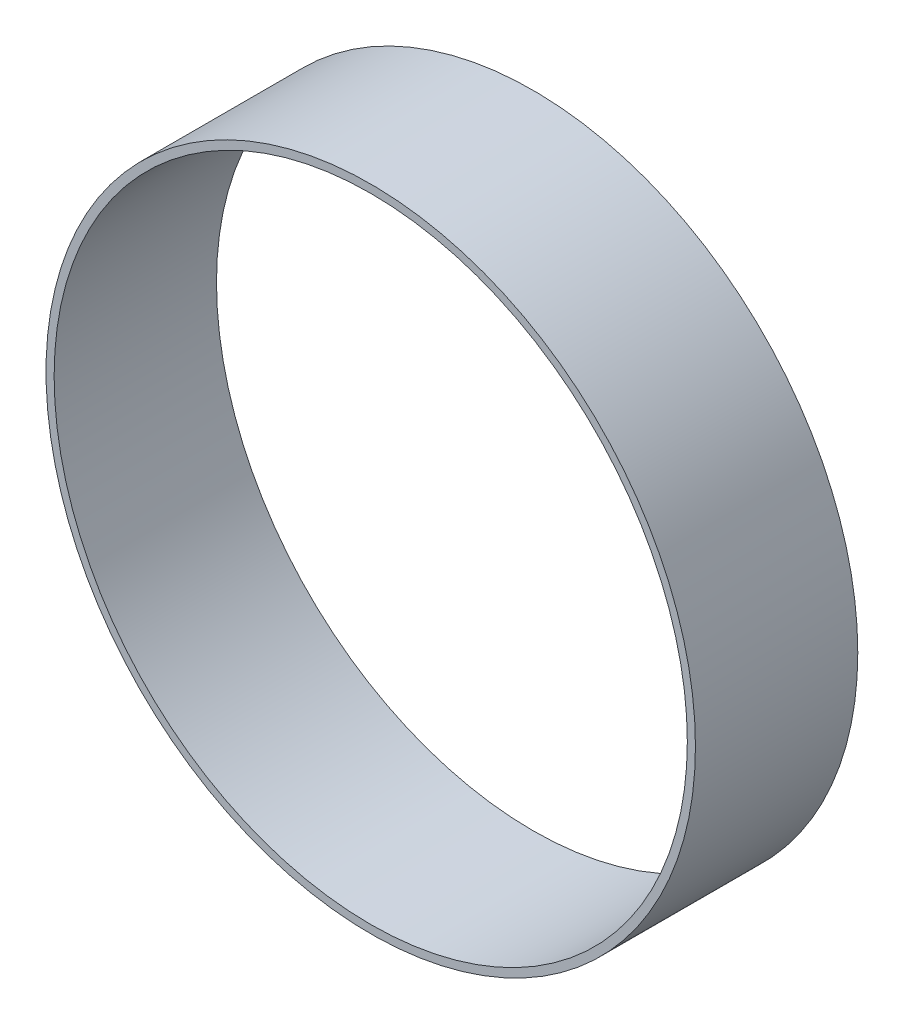
ISO-10303-21;
HEADER;
FILE_DESCRIPTION(('STEP AP214'),'2;1');
FILE_NAME('part.step','',(''),(''),'','','');
FILE_SCHEMA(('AUTOMOTIVE_DESIGN { 1 0 10303 214 1 1 1 1 }'));
ENDSEC;
DATA;
#1=APPLICATION_CONTEXT('core data for automotive mechanical design processes');
#2=APPLICATION_PROTOCOL_DEFINITION('international standard','automotive_design',2000,#1);
#3=PRODUCT_CONTEXT('',#1,'mechanical');
#4=PRODUCT('Part','Part','',(#3));
#5=PRODUCT_RELATED_PRODUCT_CATEGORY('part','',(#4));
#6=PRODUCT_DEFINITION_FORMATION('','',#4);
#7=PRODUCT_DEFINITION_CONTEXT('part definition',#1,'design');
#8=PRODUCT_DEFINITION('design','',#6,#7);
#9=PRODUCT_DEFINITION_SHAPE('','',#8);
#10=(LENGTH_UNIT() NAMED_UNIT(*) SI_UNIT(.MILLI.,.METRE.));
#11=(NAMED_UNIT(*) PLANE_ANGLE_UNIT() SI_UNIT($,.RADIAN.));
#12=(NAMED_UNIT(*) SI_UNIT($,.STERADIAN.) SOLID_ANGLE_UNIT());
#13=UNCERTAINTY_MEASURE_WITH_UNIT(LENGTH_MEASURE(1.E-05),#10,'distance_accuracy_value','');
#14=(GEOMETRIC_REPRESENTATION_CONTEXT(3) GLOBAL_UNCERTAINTY_ASSIGNED_CONTEXT((#13)) GLOBAL_UNIT_ASSIGNED_CONTEXT((#10,
#11,#12)) REPRESENTATION_CONTEXT('',''));
#15=CARTESIAN_POINT('',(0.,0.,0.));
#16=DIRECTION('',(0.,0.,1.));
#17=DIRECTION('',(1.,0.,0.));
#18=AXIS2_PLACEMENT_3D('',#15,#16,#17);
#19=CARTESIAN_POINT('',(0.,0.,25.4));
#20=DIRECTION('',(0.,0.,1.));
#21=DIRECTION('',(1.,0.,0.));
#22=AXIS2_PLACEMENT_3D('',#19,#20,#21);
#23=PLANE('',#22);
#24=CARTESIAN_POINT('',(0.,0.,25.4));
#25=DIRECTION('',(0.,0.,1.));
#26=DIRECTION('',(1.,0.,0.));
#27=AXIS2_PLACEMENT_3D('',#24,#25,#26);
#28=CIRCLE('',#27,50.8);
#29=CARTESIAN_POINT('',(50.8,0.,25.4));
#30=VERTEX_POINT('',#29);
#31=EDGE_CURVE('E10',#30,#30,#28,.T.);
#32=ORIENTED_EDGE('',*,*,#31,.T.);
#33=EDGE_LOOP('',(#32));
#34=FACE_BOUND('',#33,.T.);
#35=CARTESIAN_POINT('',(0.,0.,25.4));
#36=DIRECTION('',(0.,0.,1.));
#37=DIRECTION('',(1.,0.,0.));
#38=AXIS2_PLACEMENT_3D('',#35,#36,#37);
#39=CIRCLE('',#38,49.53);
#40=CARTESIAN_POINT('',(49.53,0.,25.4));
#41=VERTEX_POINT('',#40);
#42=EDGE_CURVE('E42',#41,#41,#39,.T.);
#43=ORIENTED_EDGE('',*,*,#42,.F.);
#44=EDGE_LOOP('',(#43));
#45=FACE_BOUND('',#44,.T.);
#46=ADVANCED_FACE('F31',(#34,#45),#23,.T.);
#47=CARTESIAN_POINT('',(0.,0.,0.));
#48=DIRECTION('',(0.,0.,1.));
#49=DIRECTION('',(1.,0.,0.));
#50=AXIS2_PLACEMENT_3D('',#47,#48,#49);
#51=PLANE('',#50);
#52=CARTESIAN_POINT('',(0.,0.,0.));
#53=DIRECTION('',(0.,0.,1.));
#54=DIRECTION('',(1.,0.,0.));
#55=AXIS2_PLACEMENT_3D('',#52,#53,#54);
#56=CIRCLE('',#55,50.8);
#57=CARTESIAN_POINT('',(50.8,0.,0.));
#58=VERTEX_POINT('',#57);
#59=EDGE_CURVE('E35',#58,#58,#56,.T.);
#60=ORIENTED_EDGE('',*,*,#59,.F.);
#61=EDGE_LOOP('',(#60));
#62=FACE_BOUND('',#61,.T.);
#63=CARTESIAN_POINT('',(0.,0.,0.));
#64=DIRECTION('',(0.,0.,1.));
#65=DIRECTION('',(1.,0.,0.));
#66=AXIS2_PLACEMENT_3D('',#63,#64,#65);
#67=CIRCLE('',#66,49.53);
#68=CARTESIAN_POINT('',(49.53,0.,0.));
#69=VERTEX_POINT('',#68);
#70=EDGE_CURVE('E44',#69,#69,#67,.T.);
#71=ORIENTED_EDGE('',*,*,#70,.T.);
#72=EDGE_LOOP('',(#71));
#73=FACE_BOUND('',#72,.T.);
#74=ADVANCED_FACE('F54',(#62,#73),#51,.F.);
#75=CARTESIAN_POINT('',(0.,0.,25.4));
#76=DIRECTION('',(0.,0.,-1.));
#77=DIRECTION('',(-1.,0.,0.));
#78=AXIS2_PLACEMENT_3D('',#75,#76,#77);
#79=CYLINDRICAL_SURFACE('',#78,50.8);
#80=ORIENTED_EDGE('',*,*,#31,.F.);
#81=EDGE_LOOP('',(#80));
#82=FACE_BOUND('',#81,.T.);
#83=ORIENTED_EDGE('',*,*,#59,.T.);
#84=EDGE_LOOP('',(#83));
#85=FACE_BOUND('',#84,.T.);
#86=ADVANCED_FACE('F33',(#82,#85),#79,.T.);
#87=CARTESIAN_POINT('',(0.,0.,25.4));
#88=DIRECTION('',(0.,0.,-1.));
#89=DIRECTION('',(-1.,0.,0.));
#90=AXIS2_PLACEMENT_3D('',#87,#88,#89);
#91=CYLINDRICAL_SURFACE('',#90,49.53);
#92=ORIENTED_EDGE('',*,*,#42,.T.);
#93=EDGE_LOOP('',(#92));
#94=FACE_BOUND('',#93,.T.);
#95=ORIENTED_EDGE('',*,*,#70,.F.);
#96=EDGE_LOOP('',(#95));
#97=FACE_BOUND('',#96,.T.);
#98=ADVANCED_FACE('F50',(#94,#97),#91,.F.);
#99=CLOSED_SHELL('',(#46,#74,#86,#98));
#100=MANIFOLD_SOLID_BREP('B2',#99);
#101=ADVANCED_BREP_SHAPE_REPRESENTATION('',(#18,#100),#14);
#102=SHAPE_DEFINITION_REPRESENTATION(#9,#101);
ENDSEC;
END-ISO-10303-21;
